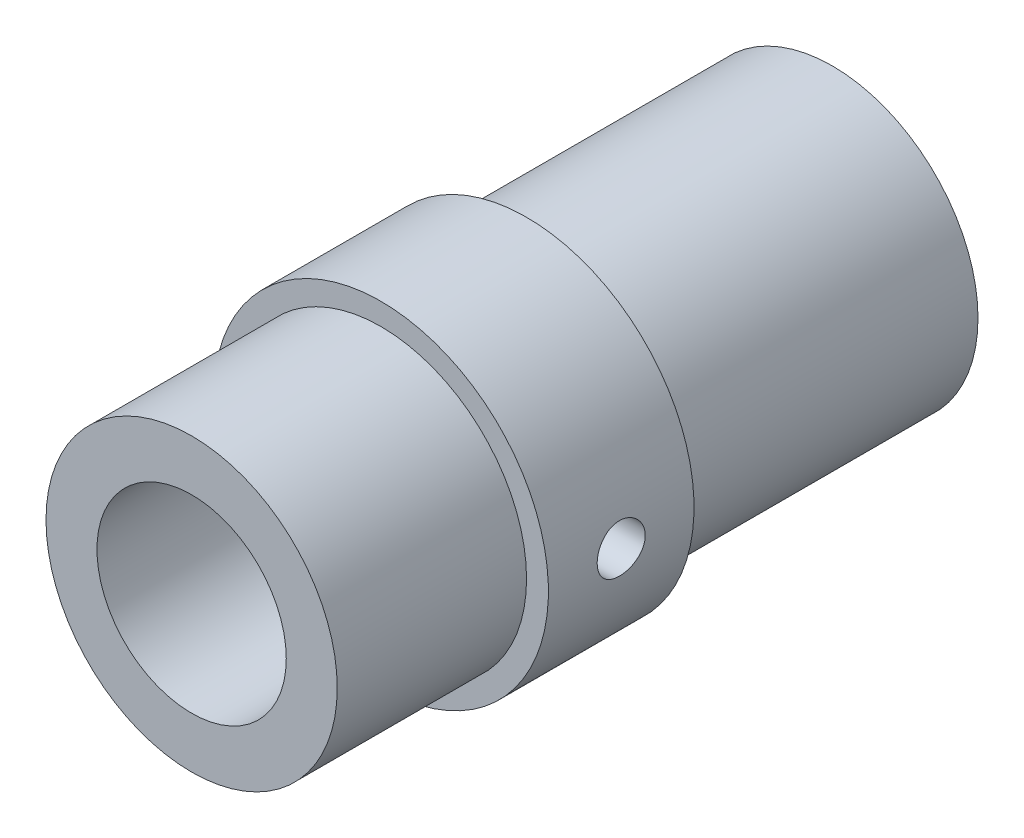
ISO-10303-21;
HEADER;
FILE_DESCRIPTION(('STEP AP214'),'2;1');
FILE_NAME('part.step','',(''),(''),'','','');
FILE_SCHEMA(('AUTOMOTIVE_DESIGN { 1 0 10303 214 1 1 1 1 }'));
ENDSEC;
DATA;
#1=APPLICATION_CONTEXT('core data for automotive mechanical design processes');
#2=APPLICATION_PROTOCOL_DEFINITION('international standard','automotive_design',2000,#1);
#3=PRODUCT_CONTEXT('',#1,'mechanical');
#4=PRODUCT('Part','Part','',(#3));
#5=PRODUCT_RELATED_PRODUCT_CATEGORY('part','',(#4));
#6=PRODUCT_DEFINITION_FORMATION('','',#4);
#7=PRODUCT_DEFINITION_CONTEXT('part definition',#1,'design');
#8=PRODUCT_DEFINITION('design','',#6,#7);
#9=PRODUCT_DEFINITION_SHAPE('','',#8);
#10=(LENGTH_UNIT() NAMED_UNIT(*) SI_UNIT(.MILLI.,.METRE.));
#11=(NAMED_UNIT(*) PLANE_ANGLE_UNIT() SI_UNIT($,.RADIAN.));
#12=(NAMED_UNIT(*) SI_UNIT($,.STERADIAN.) SOLID_ANGLE_UNIT());
#13=UNCERTAINTY_MEASURE_WITH_UNIT(LENGTH_MEASURE(1.E-05),#10,'distance_accuracy_value','');
#14=(GEOMETRIC_REPRESENTATION_CONTEXT(3) GLOBAL_UNCERTAINTY_ASSIGNED_CONTEXT((#13)) GLOBAL_UNIT_ASSIGNED_CONTEXT((#10,
#11,#12)) REPRESENTATION_CONTEXT('',''));
#15=CARTESIAN_POINT('',(0.,0.,0.));
#16=DIRECTION('',(0.,0.,1.));
#17=DIRECTION('',(1.,0.,0.));
#18=AXIS2_PLACEMENT_3D('',#15,#16,#17);
#19=CARTESIAN_POINT('',(0.,0.,44.));
#20=DIRECTION('',(0.,0.,-1.));
#21=DIRECTION('',(-1.,0.,0.));
#22=AXIS2_PLACEMENT_3D('',#19,#20,#21);
#23=CYLINDRICAL_SURFACE('',#22,10.);
#24=CARTESIAN_POINT('',(0.,0.,44.));
#25=DIRECTION('',(0.,0.,1.));
#26=DIRECTION('',(1.,0.,0.));
#27=AXIS2_PLACEMENT_3D('',#24,#25,#26);
#28=CIRCLE('',#27,10.);
#29=CARTESIAN_POINT('',(10.,0.,44.));
#30=VERTEX_POINT('',#29);
#31=EDGE_CURVE('E107',#30,#30,#28,.T.);
#32=ORIENTED_EDGE('',*,*,#31,.F.);
#33=EDGE_LOOP('',(#32));
#34=FACE_BOUND('',#33,.T.);
#35=CARTESIAN_POINT('',(0.,0.,31.));
#36=DIRECTION('',(0.,0.,-1.));
#37=DIRECTION('',(-1.,0.,0.));
#38=AXIS2_PLACEMENT_3D('',#35,#36,#37);
#39=CIRCLE('',#38,10.);
#40=CARTESIAN_POINT('',(-10.,0.,31.));
#41=VERTEX_POINT('',#40);
#42=EDGE_CURVE('E110',#41,#41,#39,.T.);
#43=ORIENTED_EDGE('',*,*,#42,.F.);
#44=EDGE_LOOP('',(#43));
#45=FACE_BOUND('',#44,.T.);
#46=ADVANCED_FACE('F40',(#34,#45),#23,.T.);
#47=CARTESIAN_POINT('',(0.,0.,44.));
#48=DIRECTION('',(0.,0.,1.));
#49=DIRECTION('',(1.,0.,0.));
#50=AXIS2_PLACEMENT_3D('',#47,#48,#49);
#51=PLANE('',#50);
#52=CARTESIAN_POINT('',(0.,0.,44.));
#53=DIRECTION('',(0.,0.,1.));
#54=DIRECTION('',(1.,0.,0.));
#55=AXIS2_PLACEMENT_3D('',#52,#53,#54);
#56=CIRCLE('',#55,6.5);
#57=CARTESIAN_POINT('',(6.5,0.,44.));
#58=VERTEX_POINT('',#57);
#59=EDGE_CURVE('E100',#58,#58,#56,.T.);
#60=ORIENTED_EDGE('',*,*,#59,.F.);
#61=EDGE_LOOP('',(#60));
#62=FACE_BOUND('',#61,.T.);
#63=ORIENTED_EDGE('',*,*,#31,.T.);
#64=EDGE_LOOP('',(#63));
#65=FACE_BOUND('',#64,.T.);
#66=ADVANCED_FACE('F148',(#62,#65),#51,.T.);
#67=CARTESIAN_POINT('',(0.,0.,17.));
#68=DIRECTION('',(0.,0.,1.));
#69=DIRECTION('',(1.,0.,0.));
#70=AXIS2_PLACEMENT_3D('',#67,#68,#69);
#71=CYLINDRICAL_SURFACE('',#70,6.5);
#72=CARTESIAN_POINT('',(6.5,0.,24.35));
#73=CARTESIAN_POINT('',(6.49999849148033,0.0911177503858729,24.3500024728557));
#74=CARTESIAN_POINT('',(6.4980650151015,0.182262858095386,24.3575730489732));
#75=CARTESIAN_POINT('',(6.49053943796148,0.361937820756667,24.3876081189059));
#76=CARTESIAN_POINT('',(6.48494533438108,0.450466216312031,24.4100807661009));
#77=CARTESIAN_POINT('',(6.47071750795578,0.622287397419871,24.4691501465638));
#78=CARTESIAN_POINT('',(6.46208749750639,0.705586431636938,24.5057296348101));
#79=CARTESIAN_POINT('',(6.44270535969817,0.864866150834565,24.5919129291593));
#80=CARTESIAN_POINT('',(6.43195314475064,0.940846533563348,24.6415172728585));
#81=CARTESIAN_POINT('',(6.40923777941342,1.08494165624618,24.7534519884888));
#82=CARTESIAN_POINT('',(6.39725548483155,1.15287927915146,24.8160064906181));
#83=CARTESIAN_POINT('',(6.37355665387332,1.2774205628457,24.9515861365439));
#84=CARTESIAN_POINT('',(6.36184014855969,1.33402290487283,25.0246124969565));
#85=CARTESIAN_POINT('',(6.33980584668286,1.43512676812557,25.1804468293445));
#86=CARTESIAN_POINT('',(6.32951232072088,1.47942889215841,25.2633879127794));
#87=CARTESIAN_POINT('',(6.31176915976443,1.55339199639589,25.4358440605568));
#88=CARTESIAN_POINT('',(6.3043190546097,1.58305539735461,25.5253580351489));
#89=CARTESIAN_POINT('',(6.29330322679465,1.62629233475193,25.7064682160975));
#90=CARTESIAN_POINT('',(6.28966059809192,1.64018493928543,25.7979834628086));
#91=CARTESIAN_POINT('',(6.28644204901193,1.65247997744377,25.9821125874049));
#92=CARTESIAN_POINT('',(6.28686544513413,1.65088501453495,26.0747262780269));
#93=CARTESIAN_POINT('',(6.29166204403964,1.63250447801232,26.25596788098));
#94=CARTESIAN_POINT('',(6.29593604050051,1.61610042228528,26.3446375220669));
#95=CARTESIAN_POINT('',(6.30779399869364,1.56917650684075,26.517923133797));
#96=CARTESIAN_POINT('',(6.31537820273062,1.53865561377152,26.6025388071895));
#97=CARTESIAN_POINT('',(6.33309221869858,1.46404250493563,26.766331127128));
#98=CARTESIAN_POINT('',(6.34324760249032,1.41981289361812,26.845442303318));
#99=CARTESIAN_POINT('',(6.364945442261,1.31913389984381,26.9952560597186));
#100=CARTESIAN_POINT('',(6.37648814769664,1.26268231826682,27.0659571231313));
#101=CARTESIAN_POINT('',(6.40007669661782,1.13719136135146,27.1991285860165));
#102=CARTESIAN_POINT('',(6.41212734929307,1.06783038255625,27.2612954691906));
#103=CARTESIAN_POINT('',(6.43506800190513,0.919522532515228,27.3731738115113));
#104=CARTESIAN_POINT('',(6.4459579641844,0.840575350431437,27.4228848666105));
#105=CARTESIAN_POINT('',(6.4654072019095,0.674894732770336,27.5085568476893));
#106=CARTESIAN_POINT('',(6.47395787369381,0.588134074053324,27.5444672069956));
#107=CARTESIAN_POINT('',(6.48770263023884,0.409541718403764,27.6011079414884));
#108=CARTESIAN_POINT('',(6.49289737755419,0.317711026327973,27.6218413131502));
#109=CARTESIAN_POINT('',(6.49924644511166,0.134179279177318,27.6470730639133));
#110=CARTESIAN_POINT('',(6.5005035683198,0.0425384989604855,27.6519846164781));
#111=CARTESIAN_POINT('',(6.4991291685556,-0.140255983188984,27.646568292535));
#112=CARTESIAN_POINT('',(6.49649800722503,-0.231409729628335,27.6362418332851));
#113=CARTESIAN_POINT('',(6.48770867929811,-0.409198092309219,27.6009828268995));
#114=CARTESIAN_POINT('',(6.48160524971031,-0.495880588598898,27.5762768233606));
#115=CARTESIAN_POINT('',(6.46656022798463,-0.663865402904551,27.5132197757114));
#116=CARTESIAN_POINT('',(6.45761834418719,-0.745167166996453,27.4748673293398));
#117=CARTESIAN_POINT('',(6.4376432610754,-0.901717887469285,27.3848131215947));
#118=CARTESIAN_POINT('',(6.42657501104735,-0.976830003962305,27.3328814403868));
#119=CARTESIAN_POINT('',(6.40362831883756,-1.11741986610505,27.2174356933685));
#120=CARTESIAN_POINT('',(6.39174973250325,-1.18289589099312,27.1539195633931));
#121=CARTESIAN_POINT('',(6.36814923136526,-1.30406635448273,27.0151871681675));
#122=CARTESIAN_POINT('',(6.35643893296219,-1.35947055793743,26.9397149948231));
#123=CARTESIAN_POINT('',(6.33483594517711,-1.45682878188372,26.7803018738935));
#124=CARTESIAN_POINT('',(6.32494317580466,-1.49878339435969,26.6963612992591));
#125=CARTESIAN_POINT('',(6.30820564851897,-1.56773755394613,26.5228391000664));
#126=CARTESIAN_POINT('',(6.30134291296739,-1.59482554658986,26.433294447436));
#127=CARTESIAN_POINT('',(6.29142787777632,-1.63350588726022,26.2507202857376));
#128=CARTESIAN_POINT('',(6.28837471379837,-1.64510175027641,26.1576915720897));
#129=CARTESIAN_POINT('',(6.28649183842141,-1.65228074681225,25.9737474217869));
#130=CARTESIAN_POINT('',(6.28753962152452,-1.64832832798558,25.8828510800002));
#131=CARTESIAN_POINT('',(6.29345653429825,-1.62558916594653,25.7030665091789));
#132=CARTESIAN_POINT('',(6.29832558250899,-1.60680273895831,25.6141782373787));
#133=CARTESIAN_POINT('',(6.31126706173436,-1.55518610871843,25.4414559315372));
#134=CARTESIAN_POINT('',(6.31931901702728,-1.522445569368,25.3575934619621));
#135=CARTESIAN_POINT('',(6.3377213707967,-1.44392066335697,25.1964911275901));
#136=CARTESIAN_POINT('',(6.34807209772023,-1.3981344324715,25.1192522113504));
#137=CARTESIAN_POINT('',(6.37025290066772,-1.29337273284388,24.9713513057558));
#138=CARTESIAN_POINT('',(6.38211523105464,-1.23407618889246,24.9009215426855));
#139=CARTESIAN_POINT('',(6.40579298687251,-1.104599377756,24.7708609857974));
#140=CARTESIAN_POINT('',(6.41760840043669,-1.03441651710484,24.7112327726088));
#141=CARTESIAN_POINT('',(6.44012670826218,-0.883564094524525,24.6033709163432));
#142=CARTESIAN_POINT('',(6.45080446058256,-0.802721933411489,24.5553730088233));
#143=CARTESIAN_POINT('',(6.46957701766543,-0.633851244249665,24.473725188642));
#144=CARTESIAN_POINT('',(6.47767362922087,-0.545827797531965,24.4400652338716));
#145=CARTESIAN_POINT('',(6.48920819390174,-0.381665270886314,24.3929096326193));
#146=CARTESIAN_POINT('',(6.49322694643271,-0.306292143202491,24.37685387482));
#147=CARTESIAN_POINT('',(6.49862338093772,-0.153952434713929,24.3553984408158));
#148=CARTESIAN_POINT('',(6.50000127455811,-0.0769859821027997,24.349997910668));
#149=CARTESIAN_POINT('',(6.5,0.,24.35));
#150=B_SPLINE_CURVE_WITH_KNOTS('',3,(#72,#73,#74,#75,#76,#77,#78,#79,#80,#81,#82,#83,#84,#85,
#86,#87,#88,#89,#90,#91,#92,#93,#94,#95,#96,#97,#98,#99,#100,#101,#102,#103,#104,#105,#106,#107,
#108,#109,#110,#111,#112,#113,#114,#115,#116,#117,#118,#119,#120,#121,#122,#123,#124,#125,#126,
#127,#128,#129,#130,#131,#132,#133,#134,#135,#136,#137,#138,#139,#140,#141,#142,#143,#144,#145,
#146,#147,#148,#149),.UNSPECIFIED.,.T.,.F.,(4,2,2,2,2,2,2,2,2,2,2,2,2,2,2,2,2,2,2,2,2,2,2,2,2,2,
2,2,2,2,2,2,2,2,2,2,2,2,4),(0.,0.273071080673042,0.546291690312231,0.819179352572712,
1.09207827994795,1.37016840025651,1.64829085517239,1.93068877591831,2.21303998185288,
2.48957086262239,2.76605525924412,3.03561386213348,3.30519219982154,3.57756487843309,
3.84998660632106,4.13042684673474,4.41087618300892,4.69234352388222,4.97375527812576,
5.2477559758474,5.52173119090106,5.79150259377978,6.06130172544542,6.33600366696575,
6.6107546039199,6.89247457814752,7.17418215075421,7.45419508187936,7.73414447043175,
8.00579583650452,8.27744141180214,8.54736720344424,8.81733158675162,9.09454331866243,
9.37182119292241,9.65432089037335,9.93662240220946,10.167360433645,10.398079972269),.UNSPECIFIED.);
#151=CARTESIAN_POINT('',(6.5,0.,24.35));
#152=VERTEX_POINT('',#151);
#153=EDGE_CURVE('E138',#152,#152,#150,.T.);
#154=ORIENTED_EDGE('',*,*,#153,.T.);
#155=EDGE_LOOP('',(#154));
#156=FACE_BOUND('',#155,.T.);
#157=CARTESIAN_POINT('',(-6.5,0.,27.65));
#158=CARTESIAN_POINT('',(-6.49999849148033,0.0911177503858729,27.6499975271442));
#159=CARTESIAN_POINT('',(-6.4980650151015,0.182262858095386,27.6424269510268));
#160=CARTESIAN_POINT('',(-6.49053943796148,0.361937820756667,27.6123918810941));
#161=CARTESIAN_POINT('',(-6.48494533438108,0.450466216312031,27.5899192338991));
#162=CARTESIAN_POINT('',(-6.47071750795578,0.622287397419871,27.5308498534362));
#163=CARTESIAN_POINT('',(-6.46208749750639,0.705586431636938,27.4942703651899));
#164=CARTESIAN_POINT('',(-6.44270535969817,0.864866150834565,27.4080870708407));
#165=CARTESIAN_POINT('',(-6.43195314475064,0.940846533563348,27.3584827271415));
#166=CARTESIAN_POINT('',(-6.40923777941342,1.08494165624618,27.2465480115112));
#167=CARTESIAN_POINT('',(-6.39725548483155,1.15287927915146,27.1839935093819));
#168=CARTESIAN_POINT('',(-6.37355665387332,1.2774205628457,27.0484138634561));
#169=CARTESIAN_POINT('',(-6.36184014855969,1.33402290487283,26.9753875030435));
#170=CARTESIAN_POINT('',(-6.33980584668286,1.43512676812557,26.8195531706555));
#171=CARTESIAN_POINT('',(-6.32951232072088,1.47942889215841,26.7366120872206));
#172=CARTESIAN_POINT('',(-6.31176915976443,1.55339199639589,26.5641559394432));
#173=CARTESIAN_POINT('',(-6.3043190546097,1.58305539735461,26.4746419648511));
#174=CARTESIAN_POINT('',(-6.29330322679465,1.62629233475193,26.2935317839025));
#175=CARTESIAN_POINT('',(-6.28966059809192,1.64018493928543,26.2020165371914));
#176=CARTESIAN_POINT('',(-6.28644204901193,1.65247997744377,26.0178874125951));
#177=CARTESIAN_POINT('',(-6.28686544513413,1.65088501453495,25.9252737219731));
#178=CARTESIAN_POINT('',(-6.29166204403964,1.63250447801232,25.74403211902));
#179=CARTESIAN_POINT('',(-6.29593604050051,1.61610042228528,25.6553624779331));
#180=CARTESIAN_POINT('',(-6.30779399869364,1.56917650684075,25.482076866203));
#181=CARTESIAN_POINT('',(-6.31537820273062,1.53865561377152,25.3974611928105));
#182=CARTESIAN_POINT('',(-6.33309221869858,1.46404250493563,25.233668872872));
#183=CARTESIAN_POINT('',(-6.34324760249032,1.41981289361812,25.154557696682));
#184=CARTESIAN_POINT('',(-6.364945442261,1.31913389984381,25.0047439402814));
#185=CARTESIAN_POINT('',(-6.37648814769664,1.26268231826682,24.9340428768687));
#186=CARTESIAN_POINT('',(-6.40007669661782,1.13719136135146,24.8008714139835));
#187=CARTESIAN_POINT('',(-6.41212734929307,1.06783038255625,24.7387045308094));
#188=CARTESIAN_POINT('',(-6.43506800190513,0.919522532515228,24.6268261884887));
#189=CARTESIAN_POINT('',(-6.4459579641844,0.840575350431437,24.5771151333895));
#190=CARTESIAN_POINT('',(-6.4654072019095,0.674894732770336,24.4914431523107));
#191=CARTESIAN_POINT('',(-6.47395787369381,0.588134074053324,24.4555327930044));
#192=CARTESIAN_POINT('',(-6.48770263023884,0.409541718403764,24.3988920585116));
#193=CARTESIAN_POINT('',(-6.49289737755419,0.317711026327973,24.3781586868498));
#194=CARTESIAN_POINT('',(-6.49924644511166,0.134179279177318,24.3529269360867));
#195=CARTESIAN_POINT('',(-6.5005035683198,0.0425384989604855,24.3480153835219));
#196=CARTESIAN_POINT('',(-6.4991291685556,-0.140255983188984,24.3534317074649));
#197=CARTESIAN_POINT('',(-6.49649800722503,-0.231409729628334,24.3637581667149));
#198=CARTESIAN_POINT('',(-6.48770867929811,-0.40919809230922,24.3990171731005));
#199=CARTESIAN_POINT('',(-6.48160524971031,-0.4958805885989,24.4237231766394));
#200=CARTESIAN_POINT('',(-6.46656022798463,-0.663865402904553,24.4867802242886));
#201=CARTESIAN_POINT('',(-6.45761834418719,-0.745167166996454,24.5251326706602));
#202=CARTESIAN_POINT('',(-6.4376432610754,-0.901717887469285,24.6151868784053));
#203=CARTESIAN_POINT('',(-6.42657501104735,-0.976830003962304,24.6671185596132));
#204=CARTESIAN_POINT('',(-6.40362831883756,-1.11741986610505,24.7825643066315));
#205=CARTESIAN_POINT('',(-6.39174973250325,-1.18289589099312,24.8460804366069));
#206=CARTESIAN_POINT('',(-6.36814923136526,-1.30406635448273,24.9848128318325));
#207=CARTESIAN_POINT('',(-6.35643893296219,-1.35947055793743,25.0602850051769));
#208=CARTESIAN_POINT('',(-6.33483594517711,-1.45682878188372,25.2196981261065));
#209=CARTESIAN_POINT('',(-6.32494317580466,-1.49878339435969,25.3036387007409));
#210=CARTESIAN_POINT('',(-6.30820564851897,-1.56773755394612,25.4771608999336));
#211=CARTESIAN_POINT('',(-6.30134291296739,-1.59482554658986,25.566705552564));
#212=CARTESIAN_POINT('',(-6.29142787777632,-1.63350588726022,25.7492797142624));
#213=CARTESIAN_POINT('',(-6.28837471379837,-1.64510175027641,25.8423084279103));
#214=CARTESIAN_POINT('',(-6.28649183842141,-1.65228074681225,26.0262525782131));
#215=CARTESIAN_POINT('',(-6.28753962152452,-1.64832832798558,26.1171489199998));
#216=CARTESIAN_POINT('',(-6.29345653429825,-1.62558916594653,26.2969334908211));
#217=CARTESIAN_POINT('',(-6.29832558250899,-1.60680273895831,26.3858217626212));
#218=CARTESIAN_POINT('',(-6.31126706173436,-1.55518610871843,26.5585440684628));
#219=CARTESIAN_POINT('',(-6.31931901702728,-1.522445569368,26.6424065380379));
#220=CARTESIAN_POINT('',(-6.3377213707967,-1.44392066335697,26.8035088724099));
#221=CARTESIAN_POINT('',(-6.34807209772023,-1.3981344324715,26.8807477886496));
#222=CARTESIAN_POINT('',(-6.37025290066772,-1.29337273284388,27.0286486942442));
#223=CARTESIAN_POINT('',(-6.38211523105464,-1.23407618889246,27.0990784573145));
#224=CARTESIAN_POINT('',(-6.40579298687251,-1.104599377756,27.2291390142026));
#225=CARTESIAN_POINT('',(-6.41760840043669,-1.03441651710484,27.2887672273912));
#226=CARTESIAN_POINT('',(-6.44012670826218,-0.883564094524525,27.3966290836568));
#227=CARTESIAN_POINT('',(-6.45080446058256,-0.802721933411489,27.4446269911767));
#228=CARTESIAN_POINT('',(-6.46957701766543,-0.633851244249665,27.526274811358));
#229=CARTESIAN_POINT('',(-6.47767362922087,-0.545827797531965,27.5599347661284));
#230=CARTESIAN_POINT('',(-6.48920819390174,-0.381665270886314,27.6070903673807));
#231=CARTESIAN_POINT('',(-6.49322694643271,-0.306292143202491,27.62314612518));
#232=CARTESIAN_POINT('',(-6.49862338093772,-0.153952434713929,27.6446015591842));
#233=CARTESIAN_POINT('',(-6.50000127455811,-0.0769859821027997,27.650002089332));
#234=CARTESIAN_POINT('',(-6.5,0.,27.65));
#235=B_SPLINE_CURVE_WITH_KNOTS('',3,(#157,#158,#159,#160,#161,#162,#163,#164,#165,#166,#167,
#168,#169,#170,#171,#172,#173,#174,#175,#176,#177,#178,#179,#180,#181,#182,#183,#184,#185,#186,
#187,#188,#189,#190,#191,#192,#193,#194,#195,#196,#197,#198,#199,#200,#201,#202,#203,#204,#205,
#206,#207,#208,#209,#210,#211,#212,#213,#214,#215,#216,#217,#218,#219,#220,#221,#222,#223,#224,
#225,#226,#227,#228,#229,#230,#231,#232,#233,#234),.UNSPECIFIED.,.T.,.F.,(4,2,2,2,2,2,2,2,2,2,2,
2,2,2,2,2,2,2,2,2,2,2,2,2,2,2,2,2,2,2,2,2,2,2,2,2,2,2,4),(0.,0.273071080673042,
0.546291690312231,0.819179352572712,1.09207827994795,1.37016840025651,1.64829085517239,
1.93068877591831,2.21303998185288,2.48957086262238,2.76605525924412,3.03561386213348,
3.30519219982154,3.57756487843309,3.84998660632106,4.13042684673474,4.41087618300892,
4.69234352388222,4.97375527812576,5.2477559758474,5.52173119090106,5.79150259377979,
6.06130172544542,6.33600366696575,6.6107546039199,6.89247457814752,7.17418215075421,
7.45419508187935,7.73414447043175,8.00579583650452,8.27744141180214,8.54736720344424,
8.81733158675162,9.09454331866243,9.37182119292241,9.65432089037335,9.93662240220946,
10.167360433645,10.398079972269),.UNSPECIFIED.);
#236=CARTESIAN_POINT('',(-6.5,0.,27.65));
#237=VERTEX_POINT('',#236);
#238=EDGE_CURVE('E133',#237,#237,#235,.T.);
#239=ORIENTED_EDGE('',*,*,#238,.T.);
#240=EDGE_LOOP('',(#239));
#241=FACE_BOUND('',#240,.T.);
#242=CARTESIAN_POINT('',(0.,0.,17.));
#243=DIRECTION('',(0.,0.,1.));
#244=DIRECTION('',(1.,0.,0.));
#245=AXIS2_PLACEMENT_3D('',#242,#243,#244);
#246=CIRCLE('',#245,6.5);
#247=CARTESIAN_POINT('',(6.5,0.,17.));
#248=VERTEX_POINT('',#247);
#249=EDGE_CURVE('E101',#248,#248,#246,.T.);
#250=ORIENTED_EDGE('',*,*,#249,.F.);
#251=EDGE_LOOP('',(#250));
#252=FACE_BOUND('',#251,.T.);
#253=ORIENTED_EDGE('',*,*,#59,.T.);
#254=EDGE_LOOP('',(#253));
#255=FACE_BOUND('',#254,.T.);
#256=ADVANCED_FACE('F142',(#156,#241,#252,#255),#71,.F.);
#257=CARTESIAN_POINT('',(0.,0.,17.));
#258=DIRECTION('',(0.,0.,1.));
#259=DIRECTION('',(1.,0.,0.));
#260=AXIS2_PLACEMENT_3D('',#257,#258,#259);
#261=PLANE('',#260);
#262=ORIENTED_EDGE('',*,*,#249,.T.);
#263=EDGE_LOOP('',(#262));
#264=FACE_BOUND('',#263,.T.);
#265=ADVANCED_FACE('F147',(#264),#261,.T.);
#266=CARTESIAN_POINT('',(0.,0.,31.));
#267=DIRECTION('',(0.,0.,-1.));
#268=DIRECTION('',(-1.,0.,0.));
#269=AXIS2_PLACEMENT_3D('',#266,#267,#268);
#270=CYLINDRICAL_SURFACE('',#269,11.5);
#271=CARTESIAN_POINT('',(11.5,0.,27.65));
#272=CARTESIAN_POINT('',(11.4999985686626,-0.0921734995925957,27.649996164412));
#273=CARTESIAN_POINT('',(11.4988801932785,-0.184401630544543,27.6422503392511));
#274=CARTESIAN_POINT('',(11.4945263895558,-0.366283180228009,27.6114777170306));
#275=CARTESIAN_POINT('',(11.4912888583859,-0.455933949111392,27.5884357413298));
#276=CARTESIAN_POINT('',(11.4830608192457,-0.630002002514528,27.5277707854311));
#277=CARTESIAN_POINT('',(11.4780715964192,-0.714423070575535,27.4901584927875));
#278=CARTESIAN_POINT('',(11.4668924774655,-0.875741589320988,27.4014459673721));
#279=CARTESIAN_POINT('',(11.4607027589491,-0.952640150415893,27.3503477294146));
#280=CARTESIAN_POINT('',(11.4477620864148,-1.09729613006044,27.2357229554136));
#281=CARTESIAN_POINT('',(11.4410077884825,-1.16499177917011,27.1721188359539));
#282=CARTESIAN_POINT('',(11.4277255973273,-1.2887876194643,27.0344546758284));
#283=CARTESIAN_POINT('',(11.4211977167119,-1.34488716580806,26.9603940540784));
#284=CARTESIAN_POINT('',(11.4090749393459,-1.44413606542082,26.8035077517998));
#285=CARTESIAN_POINT('',(11.4034843621663,-1.48722615667343,26.7206442184522));
#286=CARTESIAN_POINT('',(11.3939144727546,-1.55885433675255,26.5487625830422));
#287=CARTESIAN_POINT('',(11.3899350802204,-1.58739315083785,26.4597447879692));
#288=CARTESIAN_POINT('',(11.3840707840332,-1.62891791204245,26.2787290141281));
#289=CARTESIAN_POINT('',(11.3821716946258,-1.6420092446969,26.1867556785092));
#290=CARTESIAN_POINT('',(11.3806398803686,-1.65259379996819,26.0018995047595));
#291=CARTESIAN_POINT('',(11.3810070362926,-1.65008784315243,25.9090167147315));
#292=CARTESIAN_POINT('',(11.3839532520963,-1.62963518281596,25.725719886774));
#293=CARTESIAN_POINT('',(11.3865155493399,-1.61180549178531,25.6352924842361));
#294=CARTESIAN_POINT('',(11.3935371703854,-1.56139448614811,25.4587263349002));
#295=CARTESIAN_POINT('',(11.3979965436573,-1.52881278685332,25.3725877000055));
#296=CARTESIAN_POINT('',(11.4083285143407,-1.44969981364552,25.2066861471797));
#297=CARTESIAN_POINT('',(11.414206153957,-1.40311862047175,25.1269473609621));
#298=CARTESIAN_POINT('',(11.4267086876139,-1.29736452245498,24.9763737534862));
#299=CARTESIAN_POINT('',(11.4333336265696,-1.23819086057513,24.9055394679582));
#300=CARTESIAN_POINT('',(11.4466584920609,-1.108287526546,24.7741071378374));
#301=CARTESIAN_POINT('',(11.4533585505499,-1.03745717847067,24.7136085670222));
#302=CARTESIAN_POINT('',(11.4660223857827,-0.886595185306348,24.6053426640358));
#303=CARTESIAN_POINT('',(11.4719861597785,-0.806563505877533,24.5575753793805));
#304=CARTESIAN_POINT('',(11.4825109529896,-0.639487078680027,24.4761242803893));
#305=CARTESIAN_POINT('',(11.4870712475397,-0.552438737138112,24.4424477383765));
#306=CARTESIAN_POINT('',(11.4942690835304,-0.373842316129239,24.3902184600625));
#307=CARTESIAN_POINT('',(11.4969067438031,-0.282294515133868,24.3716647890532));
#308=CARTESIAN_POINT('',(11.4999464635563,-0.0981568420858618,24.3503392647212));
#309=CARTESIAN_POINT('',(11.5003679053784,-0.00558312480565742,24.3474305801811));
#310=CARTESIAN_POINT('',(11.4989803447973,0.178730654861955,24.3571149848649));
#311=CARTESIAN_POINT('',(11.4971714054093,0.270470740728263,24.3697076361282));
#312=CARTESIAN_POINT('',(11.4915383365586,0.450101606077696,24.4099234953062));
#313=CARTESIAN_POINT('',(11.4877230943568,0.538007524554721,24.4374804337911));
#314=CARTESIAN_POINT('',(11.4785040004583,0.707951155194202,24.5067730177461));
#315=CARTESIAN_POINT('',(11.473100079723,0.789988612140058,24.5485092794149));
#316=CARTESIAN_POINT('',(11.4612564359569,0.946470888312732,24.6452995686856));
#317=CARTESIAN_POINT('',(11.4548100216927,1.02086120887462,24.7004408715255));
#318=CARTESIAN_POINT('',(11.4416208262687,1.15938061929876,24.8223539349604));
#319=CARTESIAN_POINT('',(11.4348780294364,1.22350916569485,24.8891263111491));
#320=CARTESIAN_POINT('',(11.4217950175515,1.34017910795473,25.0330135126085));
#321=CARTESIAN_POINT('',(11.4154582387539,1.39262905659159,25.1102028466458));
#322=CARTESIAN_POINT('',(11.403964411817,1.4838183883292,25.2723763371643));
#323=CARTESIAN_POINT('',(11.3988073339814,1.52255811656764,25.3573602973577));
#324=CARTESIAN_POINT('',(11.3902813164894,1.5850838263958,25.5324317705916));
#325=CARTESIAN_POINT('',(11.3869065143413,1.60891888259408,25.6225014589531));
#326=CARTESIAN_POINT('',(11.3823112403261,1.64111540332132,25.8054171302994));
#327=CARTESIAN_POINT('',(11.3810906333826,1.64947783804561,25.8982629388394));
#328=CARTESIAN_POINT('',(11.3809466986586,1.65047011777498,26.0831843412277));
#329=CARTESIAN_POINT('',(11.3820023812131,1.64324370723938,26.1752591798676));
#330=CARTESIAN_POINT('',(11.3862465972148,1.61357045262463,26.356870060178));
#331=CARTESIAN_POINT('',(11.3894351283643,1.59112362494244,26.4464061045836));
#332=CARTESIAN_POINT('',(11.3975786708178,1.53169595436828,26.6203637288297));
#333=CARTESIAN_POINT('',(11.4025325650277,1.49472430104826,26.7047885035691));
#334=CARTESIAN_POINT('',(11.4136501354767,1.40731067266011,26.8662598761521));
#335=CARTESIAN_POINT('',(11.4198138456071,1.35686832021559,26.9433062672111));
#336=CARTESIAN_POINT('',(11.432724355553,1.24341971282961,27.0885654804745));
#337=CARTESIAN_POINT('',(11.4394758103326,1.18030677491996,27.1566945773403));
#338=CARTESIAN_POINT('',(11.4527615964323,1.04353371121136,27.2814468238661));
#339=CARTESIAN_POINT('',(11.4592958767442,0.969871128872563,27.3380672862306));
#340=CARTESIAN_POINT('',(11.4714482467629,0.813657408905604,27.4384460301277));
#341=CARTESIAN_POINT('',(11.4770615764167,0.731063539348227,27.4821383698728));
#342=CARTESIAN_POINT('',(11.4866926091392,0.559670271560149,27.5549665440221));
#343=CARTESIAN_POINT('',(11.4907119866158,0.470877501092831,27.5841176619726));
#344=CARTESIAN_POINT('',(11.4957703372606,0.318057239019964,27.620320420636));
#345=CARTESIAN_POINT('',(11.4973484325067,0.254979141752051,27.6314335400473));
#346=CARTESIAN_POINT('',(11.4994637550078,0.127942798500531,27.6462746207986));
#347=CARTESIAN_POINT('',(11.500000993599,0.0639845621102523,27.6500026625703));
#348=CARTESIAN_POINT('',(11.5,0.,27.65));
#349=B_SPLINE_CURVE_WITH_KNOTS('',3,(#271,#272,#273,#274,#275,#276,#277,#278,#279,#280,#281,
#282,#283,#284,#285,#286,#287,#288,#289,#290,#291,#292,#293,#294,#295,#296,#297,#298,#299,#300,
#301,#302,#303,#304,#305,#306,#307,#308,#309,#310,#311,#312,#313,#314,#315,#316,#317,#318,#319,
#320,#321,#322,#323,#324,#325,#326,#327,#328,#329,#330,#331,#332,#333,#334,#335,#336,#337,#338,
#339,#340,#341,#342,#343,#344,#345,#346,#347,#348),.UNSPECIFIED.,.T.,.F.,(4,2,2,2,2,2,2,2,2,2,2,
2,2,2,2,2,2,2,2,2,2,2,2,2,2,2,2,2,2,2,2,2,2,2,2,2,2,2,4),(0.,0.276286718309315,
0.552848011469763,0.829206825569717,1.10552478410829,1.38361435277841,1.66171938140811,
1.94107278487584,2.22041226356448,2.49783481211743,2.77524276570003,3.05055105589245,
3.32586652571485,3.60217560141346,3.87850129301795,4.15735253117032,4.43620481004286,
4.71520082938444,4.99417960335,5.27071441029087,5.54724140444652,5.82255366709804,
6.09787789567877,6.37504506479611,6.6522269079022,6.93150828926516,7.21078263956758,
7.48913255104037,7.76746500826761,8.04324194461238,8.31901858386293,8.59462102491026,
8.87023118766305,9.14826735439327,9.42636836888191,9.70586434847798,9.98506594166121,
10.1768594322319,10.3686508339475),.UNSPECIFIED.);
#350=CARTESIAN_POINT('',(11.5,0.,27.65));
#351=VERTEX_POINT('',#350);
#352=EDGE_CURVE('E11',#351,#351,#349,.T.);
#353=ORIENTED_EDGE('',*,*,#352,.F.);
#354=EDGE_LOOP('',(#353));
#355=FACE_BOUND('',#354,.T.);
#356=CARTESIAN_POINT('',(-11.5,0.,27.65));
#357=CARTESIAN_POINT('',(-11.4999985686626,0.0921734995925957,27.649996164412));
#358=CARTESIAN_POINT('',(-11.4988801932785,0.184401630544542,27.6422503392511));
#359=CARTESIAN_POINT('',(-11.4945263895558,0.366283180228009,27.6114777170306));
#360=CARTESIAN_POINT('',(-11.4912888583859,0.455933949111392,27.5884357413298));
#361=CARTESIAN_POINT('',(-11.4830608192457,0.630002002514528,27.5277707854311));
#362=CARTESIAN_POINT('',(-11.4780715964192,0.714423070575535,27.4901584927875));
#363=CARTESIAN_POINT('',(-11.4668924774655,0.875741589320988,27.4014459673721));
#364=CARTESIAN_POINT('',(-11.4607027589491,0.952640150415893,27.3503477294146));
#365=CARTESIAN_POINT('',(-11.4477620864148,1.09729613006044,27.2357229554136));
#366=CARTESIAN_POINT('',(-11.4410077884825,1.16499177917011,27.1721188359539));
#367=CARTESIAN_POINT('',(-11.4277255973273,1.2887876194643,27.0344546758284));
#368=CARTESIAN_POINT('',(-11.4211977167119,1.34488716580806,26.9603940540784));
#369=CARTESIAN_POINT('',(-11.4090749393459,1.44413606542082,26.8035077517998));
#370=CARTESIAN_POINT('',(-11.4034843621663,1.48722615667343,26.7206442184522));
#371=CARTESIAN_POINT('',(-11.3939144727546,1.55885433675255,26.5487625830422));
#372=CARTESIAN_POINT('',(-11.3899350802204,1.58739315083785,26.4597447879692));
#373=CARTESIAN_POINT('',(-11.3840707840332,1.62891791204245,26.2787290141281));
#374=CARTESIAN_POINT('',(-11.3821716946258,1.6420092446969,26.1867556785092));
#375=CARTESIAN_POINT('',(-11.3806398803686,1.65259379996819,26.0018995047595));
#376=CARTESIAN_POINT('',(-11.3810070362926,1.65008784315243,25.9090167147315));
#377=CARTESIAN_POINT('',(-11.3839532520963,1.62963518281596,25.725719886774));
#378=CARTESIAN_POINT('',(-11.3865155493399,1.61180549178531,25.6352924842361));
#379=CARTESIAN_POINT('',(-11.3935371703854,1.56139448614811,25.4587263349002));
#380=CARTESIAN_POINT('',(-11.3979965436573,1.52881278685332,25.3725877000055));
#381=CARTESIAN_POINT('',(-11.4083285143407,1.44969981364552,25.2066861471797));
#382=CARTESIAN_POINT('',(-11.414206153957,1.40311862047175,25.1269473609621));
#383=CARTESIAN_POINT('',(-11.4267086876139,1.29736452245498,24.9763737534862));
#384=CARTESIAN_POINT('',(-11.4333336265696,1.23819086057513,24.9055394679582));
#385=CARTESIAN_POINT('',(-11.4466584920609,1.108287526546,24.7741071378374));
#386=CARTESIAN_POINT('',(-11.4533585505499,1.03745717847067,24.7136085670222));
#387=CARTESIAN_POINT('',(-11.4660223857827,0.886595185306348,24.6053426640358));
#388=CARTESIAN_POINT('',(-11.4719861597785,0.806563505877533,24.5575753793805));
#389=CARTESIAN_POINT('',(-11.4825109529896,0.639487078680027,24.4761242803893));
#390=CARTESIAN_POINT('',(-11.4870712475397,0.552438737138112,24.4424477383765));
#391=CARTESIAN_POINT('',(-11.4942690835304,0.37384231612924,24.3902184600625));
#392=CARTESIAN_POINT('',(-11.4969067438031,0.282294515133868,24.3716647890532));
#393=CARTESIAN_POINT('',(-11.4999464635563,0.0981568420858626,24.3503392647212));
#394=CARTESIAN_POINT('',(-11.5003679053784,0.00558312480565824,24.3474305801811));
#395=CARTESIAN_POINT('',(-11.4989803447973,-0.178730654861955,24.3571149848649));
#396=CARTESIAN_POINT('',(-11.4971714054093,-0.270470740728262,24.3697076361282));
#397=CARTESIAN_POINT('',(-11.4915383365586,-0.450101606077695,24.4099234953062));
#398=CARTESIAN_POINT('',(-11.4877230943568,-0.538007524554721,24.4374804337911));
#399=CARTESIAN_POINT('',(-11.4785040004583,-0.707951155194201,24.5067730177461));
#400=CARTESIAN_POINT('',(-11.473100079723,-0.789988612140058,24.5485092794149));
#401=CARTESIAN_POINT('',(-11.4612564359569,-0.946470888312731,24.6452995686856));
#402=CARTESIAN_POINT('',(-11.4548100216927,-1.02086120887462,24.7004408715255));
#403=CARTESIAN_POINT('',(-11.4416208262687,-1.15938061929876,24.8223539349604));
#404=CARTESIAN_POINT('',(-11.4348780294364,-1.22350916569485,24.8891263111491));
#405=CARTESIAN_POINT('',(-11.4217950175515,-1.34017910795473,25.0330135126085));
#406=CARTESIAN_POINT('',(-11.4154582387539,-1.39262905659159,25.1102028466458));
#407=CARTESIAN_POINT('',(-11.403964411817,-1.4838183883292,25.2723763371643));
#408=CARTESIAN_POINT('',(-11.3988073339814,-1.52255811656764,25.3573602973577));
#409=CARTESIAN_POINT('',(-11.3902813164894,-1.5850838263958,25.5324317705916));
#410=CARTESIAN_POINT('',(-11.3869065143413,-1.60891888259408,25.6225014589531));
#411=CARTESIAN_POINT('',(-11.3823112403261,-1.64111540332132,25.8054171302994));
#412=CARTESIAN_POINT('',(-11.3810906333826,-1.64947783804561,25.8982629388394));
#413=CARTESIAN_POINT('',(-11.3809466986586,-1.65047011777498,26.0831843412277));
#414=CARTESIAN_POINT('',(-11.3820023812131,-1.64324370723938,26.1752591798676));
#415=CARTESIAN_POINT('',(-11.3862465972148,-1.61357045262463,26.356870060178));
#416=CARTESIAN_POINT('',(-11.3894351283643,-1.59112362494244,26.4464061045836));
#417=CARTESIAN_POINT('',(-11.3975786708178,-1.53169595436828,26.6203637288297));
#418=CARTESIAN_POINT('',(-11.4025325650277,-1.49472430104826,26.7047885035691));
#419=CARTESIAN_POINT('',(-11.4136501354767,-1.40731067266011,26.8662598761521));
#420=CARTESIAN_POINT('',(-11.4198138456071,-1.35686832021559,26.9433062672111));
#421=CARTESIAN_POINT('',(-11.432724355553,-1.24341971282961,27.0885654804745));
#422=CARTESIAN_POINT('',(-11.4394758103326,-1.18030677491996,27.1566945773403));
#423=CARTESIAN_POINT('',(-11.4527615964323,-1.04353371121136,27.2814468238661));
#424=CARTESIAN_POINT('',(-11.4592958767442,-0.969871128872563,27.3380672862306));
#425=CARTESIAN_POINT('',(-11.4714482467629,-0.813657408905604,27.4384460301277));
#426=CARTESIAN_POINT('',(-11.4770615764167,-0.731063539348227,27.4821383698728));
#427=CARTESIAN_POINT('',(-11.4866926091392,-0.559670271560149,27.5549665440221));
#428=CARTESIAN_POINT('',(-11.4907119866158,-0.470877501092831,27.5841176619726));
#429=CARTESIAN_POINT('',(-11.4957703372606,-0.318057239019963,27.620320420636));
#430=CARTESIAN_POINT('',(-11.4973484325067,-0.254979141752051,27.6314335400473));
#431=CARTESIAN_POINT('',(-11.4994637550078,-0.127942798500531,27.6462746207986));
#432=CARTESIAN_POINT('',(-11.500000993599,-0.0639845621102523,27.6500026625703));
#433=CARTESIAN_POINT('',(-11.5,0.,27.65));
#434=B_SPLINE_CURVE_WITH_KNOTS('',3,(#356,#357,#358,#359,#360,#361,#362,#363,#364,#365,#366,
#367,#368,#369,#370,#371,#372,#373,#374,#375,#376,#377,#378,#379,#380,#381,#382,#383,#384,#385,
#386,#387,#388,#389,#390,#391,#392,#393,#394,#395,#396,#397,#398,#399,#400,#401,#402,#403,#404,
#405,#406,#407,#408,#409,#410,#411,#412,#413,#414,#415,#416,#417,#418,#419,#420,#421,#422,#423,
#424,#425,#426,#427,#428,#429,#430,#431,#432,#433),.UNSPECIFIED.,.T.,.F.,(4,2,2,2,2,2,2,2,2,2,2,
2,2,2,2,2,2,2,2,2,2,2,2,2,2,2,2,2,2,2,2,2,2,2,2,2,2,2,4),(0.,0.276286718309315,
0.552848011469763,0.829206825569716,1.10552478410829,1.38361435277841,1.66171938140811,
1.94107278487584,2.22041226356448,2.49783481211743,2.77524276570003,3.05055105589245,
3.32586652571485,3.60217560141346,3.87850129301795,4.15735253117032,4.43620481004286,
4.71520082938444,4.99417960335,5.27071441029087,5.54724140444652,5.82255366709804,
6.09787789567877,6.37504506479611,6.6522269079022,6.93150828926516,7.21078263956758,
7.48913255104038,7.76746500826761,8.04324194461238,8.31901858386293,8.59462102491026,
8.87023118766305,9.14826735439327,9.42636836888191,9.70586434847798,9.98506594166121,
10.1768594322319,10.3686508339475),.UNSPECIFIED.);
#435=CARTESIAN_POINT('',(-11.5,0.,27.65));
#436=VERTEX_POINT('',#435);
#437=EDGE_CURVE('E52',#436,#436,#434,.T.);
#438=ORIENTED_EDGE('',*,*,#437,.F.);
#439=EDGE_LOOP('',(#438));
#440=FACE_BOUND('',#439,.T.);
#441=CARTESIAN_POINT('',(0.,0.,31.));
#442=DIRECTION('',(0.,0.,-1.));
#443=DIRECTION('',(-1.,0.,0.));
#444=AXIS2_PLACEMENT_3D('',#441,#442,#443);
#445=CIRCLE('',#444,11.5);
#446=CARTESIAN_POINT('',(-11.5,0.,31.));
#447=VERTEX_POINT('',#446);
#448=EDGE_CURVE('E82',#447,#447,#445,.T.);
#449=ORIENTED_EDGE('',*,*,#448,.T.);
#450=EDGE_LOOP('',(#449));
#451=FACE_BOUND('',#450,.T.);
#452=CARTESIAN_POINT('',(0.,0.,21.));
#453=DIRECTION('',(0.,0.,-1.));
#454=DIRECTION('',(-1.,0.,0.));
#455=AXIS2_PLACEMENT_3D('',#452,#453,#454);
#456=CIRCLE('',#455,11.5);
#457=CARTESIAN_POINT('',(-11.5,0.,21.));
#458=VERTEX_POINT('',#457);
#459=EDGE_CURVE('E180',#458,#458,#456,.T.);
#460=ORIENTED_EDGE('',*,*,#459,.F.);
#461=EDGE_LOOP('',(#460));
#462=FACE_BOUND('',#461,.T.);
#463=ADVANCED_FACE('F117',(#355,#440,#451,#462),#270,.T.);
#464=CARTESIAN_POINT('',(0.,0.,31.));
#465=DIRECTION('',(0.,0.,-1.));
#466=DIRECTION('',(-1.,0.,0.));
#467=AXIS2_PLACEMENT_3D('',#464,#465,#466);
#468=PLANE('',#467);
#469=ORIENTED_EDGE('',*,*,#42,.T.);
#470=EDGE_LOOP('',(#469));
#471=FACE_BOUND('',#470,.T.);
#472=ORIENTED_EDGE('',*,*,#448,.F.);
#473=EDGE_LOOP('',(#472));
#474=FACE_BOUND('',#473,.T.);
#475=ADVANCED_FACE('F127',(#471,#474),#468,.F.);
#476=CARTESIAN_POINT('',(0.,0.,21.));
#477=DIRECTION('',(0.,0.,-1.));
#478=DIRECTION('',(-1.,0.,0.));
#479=AXIS2_PLACEMENT_3D('',#476,#477,#478);
#480=PLANE('',#479);
#481=CARTESIAN_POINT('',(0.,0.,21.));
#482=DIRECTION('',(0.,0.,-1.));
#483=DIRECTION('',(-1.,0.,0.));
#484=AXIS2_PLACEMENT_3D('',#481,#482,#483);
#485=CIRCLE('',#484,10.);
#486=CARTESIAN_POINT('',(-10.,0.,21.));
#487=VERTEX_POINT('',#486);
#488=EDGE_CURVE('E183',#487,#487,#485,.T.);
#489=ORIENTED_EDGE('',*,*,#488,.F.);
#490=EDGE_LOOP('',(#489));
#491=FACE_BOUND('',#490,.T.);
#492=ORIENTED_EDGE('',*,*,#459,.T.);
#493=EDGE_LOOP('',(#492));
#494=FACE_BOUND('',#493,.T.);
#495=ADVANCED_FACE('F176',(#491,#494),#480,.T.);
#496=CARTESIAN_POINT('',(4.24264068711931,-4.24264068711926,8.49999999999999));
#497=DIRECTION('',(0.,0.,-1.));
#498=DIRECTION('',(-1.,0.,0.));
#499=AXIS2_PLACEMENT_3D('',#496,#497,#498);
#500=CONICAL_SURFACE('',#499,1.24999999999999,1.02974425867665);
#501=CARTESIAN_POINT('',(4.2426406871193,-4.24264068711926,9.25107577378444));
#502=VERTEX_POINT('',#501);
#503=VERTEX_LOOP('',#502);
#504=FACE_BOUND('',#503,.T.);
#505=CARTESIAN_POINT('',(4.24264068711931,-4.24264068711926,8.49999999999999));
#506=DIRECTION('',(0.,0.,-1.));
#507=DIRECTION('',(-1.,0.,0.));
#508=AXIS2_PLACEMENT_3D('',#505,#506,#507);
#509=CIRCLE('',#508,1.24999999999999);
#510=CARTESIAN_POINT('',(2.99264068711932,-4.24264068711926,8.49999999999999));
#511=VERTEX_POINT('',#510);
#512=EDGE_CURVE('E97',#511,#511,#509,.T.);
#513=ORIENTED_EDGE('',*,*,#512,.T.);
#514=EDGE_LOOP('',(#513));
#515=FACE_BOUND('',#514,.T.);
#516=ADVANCED_FACE('F211',(#504,#515),#500,.F.);
#517=CARTESIAN_POINT('',(-4.24264068711931,-4.24264068711926,8.49999999999999));
#518=DIRECTION('',(0.,0.,-1.));
#519=DIRECTION('',(-1.,0.,0.));
#520=AXIS2_PLACEMENT_3D('',#517,#518,#519);
#521=CONICAL_SURFACE('',#520,1.24999999999999,1.02974425867665);
#522=CARTESIAN_POINT('',(-4.24264068711931,-4.24264068711926,9.25107577378444));
#523=VERTEX_POINT('',#522);
#524=VERTEX_LOOP('',#523);
#525=FACE_BOUND('',#524,.T.);
#526=CARTESIAN_POINT('',(-4.24264068711931,-4.24264068711926,8.49999999999999));
#527=DIRECTION('',(0.,0.,-1.));
#528=DIRECTION('',(-1.,0.,0.));
#529=AXIS2_PLACEMENT_3D('',#526,#527,#528);
#530=CIRCLE('',#529,1.24999999999999);
#531=CARTESIAN_POINT('',(-5.4926406871193,-4.24264068711926,8.49999999999999));
#532=VERTEX_POINT('',#531);
#533=EDGE_CURVE('E91',#532,#532,#530,.T.);
#534=ORIENTED_EDGE('',*,*,#533,.T.);
#535=EDGE_LOOP('',(#534));
#536=FACE_BOUND('',#535,.T.);
#537=ADVANCED_FACE('F216',(#525,#536),#521,.F.);
#538=CARTESIAN_POINT('',(-4.24264068711928,4.24264068711929,8.49999999999999));
#539=DIRECTION('',(0.,0.,-1.));
#540=DIRECTION('',(-1.,0.,0.));
#541=AXIS2_PLACEMENT_3D('',#538,#539,#540);
#542=CONICAL_SURFACE('',#541,1.24999999999999,1.02974425867665);
#543=CARTESIAN_POINT('',(-4.24264068711928,4.24264068711929,9.25107577378444));
#544=VERTEX_POINT('',#543);
#545=VERTEX_LOOP('',#544);
#546=FACE_BOUND('',#545,.T.);
#547=CARTESIAN_POINT('',(-4.24264068711928,4.24264068711929,8.49999999999999));
#548=DIRECTION('',(0.,0.,-1.));
#549=DIRECTION('',(-1.,0.,0.));
#550=AXIS2_PLACEMENT_3D('',#547,#548,#549);
#551=CIRCLE('',#550,1.24999999999999);
#552=CARTESIAN_POINT('',(-5.49264068711926,4.24264068711929,8.49999999999999));
#553=VERTEX_POINT('',#552);
#554=EDGE_CURVE('E79',#553,#553,#551,.T.);
#555=ORIENTED_EDGE('',*,*,#554,.T.);
#556=EDGE_LOOP('',(#555));
#557=FACE_BOUND('',#556,.T.);
#558=ADVANCED_FACE('F69',(#546,#557),#542,.F.);
#559=CARTESIAN_POINT('',(4.24264068711931,4.24264068711926,8.49999999999999));
#560=DIRECTION('',(0.,0.,-1.));
#561=DIRECTION('',(-1.,0.,0.));
#562=AXIS2_PLACEMENT_3D('',#559,#560,#561);
#563=CONICAL_SURFACE('',#562,1.24999999999999,1.02974425867665);
#564=CARTESIAN_POINT('',(4.2426406871193,4.24264068711926,9.25107577378444));
#565=VERTEX_POINT('',#564);
#566=VERTEX_LOOP('',#565);
#567=FACE_BOUND('',#566,.T.);
#568=CARTESIAN_POINT('',(4.24264068711931,4.24264068711926,8.49999999999999));
#569=DIRECTION('',(0.,0.,-1.));
#570=DIRECTION('',(-1.,0.,0.));
#571=AXIS2_PLACEMENT_3D('',#568,#569,#570);
#572=CIRCLE('',#571,1.24999999999999);
#573=CARTESIAN_POINT('',(2.99264068711932,4.24264068711926,8.49999999999999));
#574=VERTEX_POINT('',#573);
#575=EDGE_CURVE('E73',#574,#574,#572,.T.);
#576=ORIENTED_EDGE('',*,*,#575,.T.);
#577=EDGE_LOOP('',(#576));
#578=FACE_BOUND('',#577,.T.);
#579=ADVANCED_FACE('F65',(#567,#578),#563,.F.);
#580=CARTESIAN_POINT('',(4.24264068711931,-4.24264068711926,0.));
#581=DIRECTION('',(0.,0.,-1.));
#582=DIRECTION('',(-1.,0.,0.));
#583=AXIS2_PLACEMENT_3D('',#580,#581,#582);
#584=CYLINDRICAL_SURFACE('',#583,1.24999999999999);
#585=ORIENTED_EDGE('',*,*,#512,.F.);
#586=EDGE_LOOP('',(#585));
#587=FACE_BOUND('',#586,.T.);
#588=CARTESIAN_POINT('',(4.24264068711931,-4.24264068711926,0.));
#589=DIRECTION('',(0.,0.,-1.));
#590=DIRECTION('',(-1.,0.,0.));
#591=AXIS2_PLACEMENT_3D('',#588,#589,#590);
#592=CIRCLE('',#591,1.24999999999999);
#593=CARTESIAN_POINT('',(2.99264068711932,-4.24264068711926,0.));
#594=VERTEX_POINT('',#593);
#595=EDGE_CURVE('E94',#594,#594,#592,.T.);
#596=ORIENTED_EDGE('',*,*,#595,.T.);
#597=EDGE_LOOP('',(#596));
#598=FACE_BOUND('',#597,.T.);
#599=ADVANCED_FACE('F68',(#587,#598),#584,.F.);
#600=CARTESIAN_POINT('',(-4.24264068711931,-4.24264068711926,0.));
#601=DIRECTION('',(0.,0.,-1.));
#602=DIRECTION('',(-1.,0.,0.));
#603=AXIS2_PLACEMENT_3D('',#600,#601,#602);
#604=CYLINDRICAL_SURFACE('',#603,1.24999999999999);
#605=ORIENTED_EDGE('',*,*,#533,.F.);
#606=EDGE_LOOP('',(#605));
#607=FACE_BOUND('',#606,.T.);
#608=CARTESIAN_POINT('',(-4.24264068711931,-4.24264068711926,0.));
#609=DIRECTION('',(0.,0.,-1.));
#610=DIRECTION('',(-1.,0.,0.));
#611=AXIS2_PLACEMENT_3D('',#608,#609,#610);
#612=CIRCLE('',#611,1.24999999999999);
#613=CARTESIAN_POINT('',(-5.4926406871193,-4.24264068711926,0.));
#614=VERTEX_POINT('',#613);
#615=EDGE_CURVE('E88',#614,#614,#612,.T.);
#616=ORIENTED_EDGE('',*,*,#615,.T.);
#617=EDGE_LOOP('',(#616));
#618=FACE_BOUND('',#617,.T.);
#619=ADVANCED_FACE('F224',(#607,#618),#604,.F.);
#620=CARTESIAN_POINT('',(-4.24264068711928,4.24264068711929,0.));
#621=DIRECTION('',(0.,0.,-1.));
#622=DIRECTION('',(-1.,0.,0.));
#623=AXIS2_PLACEMENT_3D('',#620,#621,#622);
#624=CYLINDRICAL_SURFACE('',#623,1.24999999999999);
#625=ORIENTED_EDGE('',*,*,#554,.F.);
#626=EDGE_LOOP('',(#625));
#627=FACE_BOUND('',#626,.T.);
#628=CARTESIAN_POINT('',(-4.24264068711928,4.24264068711929,0.));
#629=DIRECTION('',(0.,0.,-1.));
#630=DIRECTION('',(-1.,0.,0.));
#631=AXIS2_PLACEMENT_3D('',#628,#629,#630);
#632=CIRCLE('',#631,1.24999999999999);
#633=CARTESIAN_POINT('',(-5.49264068711927,4.24264068711929,0.));
#634=VERTEX_POINT('',#633);
#635=EDGE_CURVE('E75',#634,#634,#632,.T.);
#636=ORIENTED_EDGE('',*,*,#635,.T.);
#637=EDGE_LOOP('',(#636));
#638=FACE_BOUND('',#637,.T.);
#639=ADVANCED_FACE('F163',(#627,#638),#624,.F.);
#640=CARTESIAN_POINT('',(4.24264068711931,4.24264068711926,0.));
#641=DIRECTION('',(0.,0.,-1.));
#642=DIRECTION('',(-1.,0.,0.));
#643=AXIS2_PLACEMENT_3D('',#640,#641,#642);
#644=CYLINDRICAL_SURFACE('',#643,1.24999999999999);
#645=ORIENTED_EDGE('',*,*,#575,.F.);
#646=EDGE_LOOP('',(#645));
#647=FACE_BOUND('',#646,.T.);
#648=CARTESIAN_POINT('',(4.24264068711931,4.24264068711926,0.));
#649=DIRECTION('',(0.,0.,-1.));
#650=DIRECTION('',(-1.,0.,0.));
#651=AXIS2_PLACEMENT_3D('',#648,#649,#650);
#652=CIRCLE('',#651,1.24999999999999);
#653=CARTESIAN_POINT('',(2.99264068711932,4.24264068711926,0.));
#654=VERTEX_POINT('',#653);
#655=EDGE_CURVE('E76',#654,#654,#652,.T.);
#656=ORIENTED_EDGE('',*,*,#655,.T.);
#657=EDGE_LOOP('',(#656));
#658=FACE_BOUND('',#657,.T.);
#659=ADVANCED_FACE('F156',(#647,#658),#644,.F.);
#660=CARTESIAN_POINT('',(0.,0.,0.));
#661=DIRECTION('',(0.,0.,1.));
#662=DIRECTION('',(1.,0.,0.));
#663=AXIS2_PLACEMENT_3D('',#660,#661,#662);
#664=PLANE('',#663);
#665=ORIENTED_EDGE('',*,*,#655,.F.);
#666=EDGE_LOOP('',(#665));
#667=FACE_BOUND('',#666,.T.);
#668=ORIENTED_EDGE('',*,*,#635,.F.);
#669=EDGE_LOOP('',(#668));
#670=FACE_BOUND('',#669,.T.);
#671=ORIENTED_EDGE('',*,*,#615,.F.);
#672=EDGE_LOOP('',(#671));
#673=FACE_BOUND('',#672,.T.);
#674=ORIENTED_EDGE('',*,*,#595,.F.);
#675=EDGE_LOOP('',(#674));
#676=FACE_BOUND('',#675,.T.);
#677=CARTESIAN_POINT('',(0.,0.,0.));
#678=DIRECTION('',(0.,0.,1.));
#679=DIRECTION('',(1.,0.,0.));
#680=AXIS2_PLACEMENT_3D('',#677,#678,#679);
#681=CIRCLE('',#680,10.);
#682=CARTESIAN_POINT('',(10.,0.,0.));
#683=VERTEX_POINT('',#682);
#684=EDGE_CURVE('E104',#683,#683,#681,.T.);
#685=ORIENTED_EDGE('',*,*,#684,.F.);
#686=EDGE_LOOP('',(#685));
#687=FACE_BOUND('',#686,.T.);
#688=ADVANCED_FACE('F154',(#667,#670,#673,#676,#687),#664,.F.);
#689=ORIENTED_EDGE('',*,*,#488,.T.);
#690=EDGE_LOOP('',(#689));
#691=FACE_BOUND('',#690,.T.);
#692=ORIENTED_EDGE('',*,*,#684,.T.);
#693=EDGE_LOOP('',(#692));
#694=FACE_BOUND('',#693,.T.);
#695=ADVANCED_FACE('F42',(#691,#694),#23,.T.);
#696=CARTESIAN_POINT('',(-11.5,0.,26.));
#697=DIRECTION('',(-1.,0.,0.));
#698=DIRECTION('',(0.,0.,1.));
#699=AXIS2_PLACEMENT_3D('',#696,#697,#698);
#700=CYLINDRICAL_SURFACE('',#699,1.64999999999999);
#701=ORIENTED_EDGE('',*,*,#437,.T.);
#702=EDGE_LOOP('',(#701));
#703=FACE_BOUND('',#702,.T.);
#704=ORIENTED_EDGE('',*,*,#238,.F.);
#705=EDGE_LOOP('',(#704));
#706=FACE_BOUND('',#705,.T.);
#707=ADVANCED_FACE('F125',(#703,#706),#700,.F.);
#708=ORIENTED_EDGE('',*,*,#352,.T.);
#709=EDGE_LOOP('',(#708));
#710=FACE_BOUND('',#709,.T.);
#711=ORIENTED_EDGE('',*,*,#153,.F.);
#712=EDGE_LOOP('',(#711));
#713=FACE_BOUND('',#712,.T.);
#714=ADVANCED_FACE('F121',(#710,#713),#700,.F.);
#715=CLOSED_SHELL('',(#46,#66,#256,#265,#463,#475,#495,#516,#537,#558,#579,#599,#619,#639,#659,
#688,#695,#707,#714));
#716=MANIFOLD_SOLID_BREP('B2',#715);
#717=ADVANCED_BREP_SHAPE_REPRESENTATION('',(#18,#716),#14);
#718=SHAPE_DEFINITION_REPRESENTATION(#9,#717);
ENDSEC;
END-ISO-10303-21;
